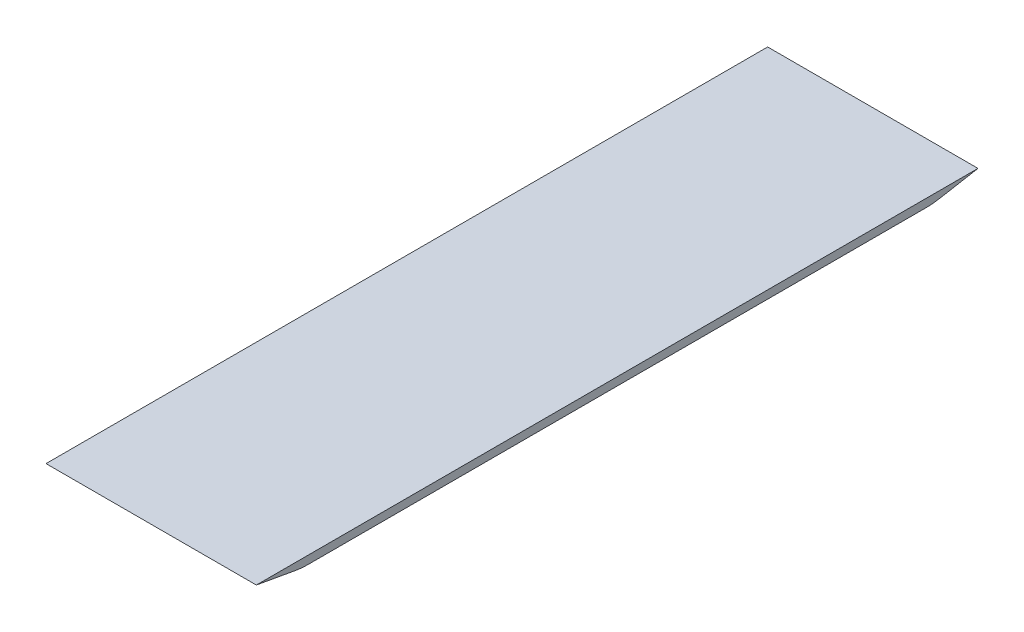
ISO-10303-21;
HEADER;
FILE_DESCRIPTION(('STEP AP214'),'2;1');
FILE_NAME('part.step','',(''),(''),'','','');
FILE_SCHEMA(('AUTOMOTIVE_DESIGN { 1 0 10303 214 1 1 1 1 }'));
ENDSEC;
DATA;
#1=APPLICATION_CONTEXT('core data for automotive mechanical design processes');
#2=APPLICATION_PROTOCOL_DEFINITION('international standard','automotive_design',2000,#1);
#3=PRODUCT_CONTEXT('',#1,'mechanical');
#4=PRODUCT('Part','Part','',(#3));
#5=PRODUCT_RELATED_PRODUCT_CATEGORY('part','',(#4));
#6=PRODUCT_DEFINITION_FORMATION('','',#4);
#7=PRODUCT_DEFINITION_CONTEXT('part definition',#1,'design');
#8=PRODUCT_DEFINITION('design','',#6,#7);
#9=PRODUCT_DEFINITION_SHAPE('','',#8);
#10=(LENGTH_UNIT() NAMED_UNIT(*) SI_UNIT(.MILLI.,.METRE.));
#11=(NAMED_UNIT(*) PLANE_ANGLE_UNIT() SI_UNIT($,.RADIAN.));
#12=(NAMED_UNIT(*) SI_UNIT($,.STERADIAN.) SOLID_ANGLE_UNIT());
#13=UNCERTAINTY_MEASURE_WITH_UNIT(LENGTH_MEASURE(1.E-05),#10,'distance_accuracy_value','');
#14=(GEOMETRIC_REPRESENTATION_CONTEXT(3) GLOBAL_UNCERTAINTY_ASSIGNED_CONTEXT((#13)) GLOBAL_UNIT_ASSIGNED_CONTEXT((#10,
#11,#12)) REPRESENTATION_CONTEXT('',''));
#15=CARTESIAN_POINT('',(0.,0.,0.));
#16=DIRECTION('',(0.,0.,1.));
#17=DIRECTION('',(1.,0.,0.));
#18=AXIS2_PLACEMENT_3D('',#15,#16,#17);
#19=CARTESIAN_POINT('',(130.,0.,-446.));
#20=DIRECTION('',(0.,-0.984427575508482,-0.175790638483657));
#21=DIRECTION('',(0.,0.175790638483657,-0.984427575508482));
#22=AXIS2_PLACEMENT_3D('',#19,#20,#21);
#23=PLANE('',#22);
#24=DIRECTION('',(0.,-0.175790638483657,0.984427575508482));
#25=VECTOR('',#24,1.);
#26=CARTESIAN_POINT('',(130.,0.,-446.));
#27=LINE('',#26,#25);
#28=CARTESIAN_POINT('',(130.,0.,-446.));
#29=VERTEX_POINT('',#28);
#30=CARTESIAN_POINT('',(130.,-4.22137877542409,-422.360278857625));
#31=VERTEX_POINT('',#30);
#32=EDGE_CURVE('E111',#29,#31,#27,.T.);
#33=ORIENTED_EDGE('',*,*,#32,.T.);
#34=DIRECTION('',(-1.,0.,0.));
#35=VECTOR('',#34,1.);
#36=CARTESIAN_POINT('',(130.,-4.22137877542409,-422.360278857625));
#37=LINE('',#36,#35);
#38=CARTESIAN_POINT('',(0.,-4.22137877542409,-422.360278857625));
#39=VERTEX_POINT('',#38);
#40=EDGE_CURVE('E11',#31,#39,#37,.T.);
#41=ORIENTED_EDGE('',*,*,#40,.T.);
#42=DIRECTION('',(0.,-0.175790638483657,0.984427575508482));
#43=VECTOR('',#42,1.);
#44=CARTESIAN_POINT('',(0.,0.,-446.));
#45=LINE('',#44,#43);
#46=CARTESIAN_POINT('',(0.,0.,-446.));
#47=VERTEX_POINT('',#46);
#48=EDGE_CURVE('E115',#47,#39,#45,.T.);
#49=ORIENTED_EDGE('',*,*,#48,.F.);
#50=DIRECTION('',(-1.,0.,0.));
#51=VECTOR('',#50,1.);
#52=CARTESIAN_POINT('',(130.,0.,-446.));
#53=LINE('',#52,#51);
#54=EDGE_CURVE('E108',#29,#47,#53,.T.);
#55=ORIENTED_EDGE('',*,*,#54,.F.);
#56=EDGE_LOOP('',(#33,#41,#49,#55));
#57=FACE_BOUND('',#56,.T.);
#58=ADVANCED_FACE('F39',(#57),#23,.T.);
#59=CARTESIAN_POINT('',(130.,0.,0.));
#60=DIRECTION('',(0.,1.,0.));
#61=DIRECTION('',(0.,0.,1.));
#62=AXIS2_PLACEMENT_3D('',#59,#60,#61);
#63=PLANE('',#62);
#64=DIRECTION('',(0.,0.,-1.));
#65=VECTOR('',#64,1.);
#66=CARTESIAN_POINT('',(0.,0.,0.));
#67=LINE('',#66,#65);
#68=CARTESIAN_POINT('',(0.,0.,0.));
#69=VERTEX_POINT('',#68);
#70=EDGE_CURVE('E107',#69,#47,#67,.T.);
#71=ORIENTED_EDGE('',*,*,#70,.F.);
#72=DIRECTION('',(-1.,0.,0.));
#73=VECTOR('',#72,1.);
#74=CARTESIAN_POINT('',(130.,0.,0.));
#75=LINE('',#74,#73);
#76=CARTESIAN_POINT('',(130.,0.,0.));
#77=VERTEX_POINT('',#76);
#78=EDGE_CURVE('E96',#77,#69,#75,.T.);
#79=ORIENTED_EDGE('',*,*,#78,.F.);
#80=DIRECTION('',(0.,0.,-1.));
#81=VECTOR('',#80,1.);
#82=CARTESIAN_POINT('',(130.,0.,0.));
#83=LINE('',#82,#81);
#84=EDGE_CURVE('E100',#77,#29,#83,.T.);
#85=ORIENTED_EDGE('',*,*,#84,.T.);
#86=ORIENTED_EDGE('',*,*,#54,.T.);
#87=EDGE_LOOP('',(#71,#79,#85,#86));
#88=FACE_BOUND('',#87,.T.);
#89=ADVANCED_FACE('F105',(#88),#63,.T.);
#90=CARTESIAN_POINT('',(130.,-5.00000000000005,-28.));
#91=DIRECTION('',(0.,-0.984427575508482,0.175790638483659));
#92=DIRECTION('',(0.,-0.175790638483659,-0.984427575508482));
#93=AXIS2_PLACEMENT_3D('',#90,#91,#92);
#94=PLANE('',#93);
#95=DIRECTION('',(0.,0.175790638483659,0.984427575508482));
#96=VECTOR('',#95,1.);
#97=CARTESIAN_POINT('',(0.,-5.00000000000005,-28.));
#98=LINE('',#97,#96);
#99=CARTESIAN_POINT('',(0.,-4.22137877542412,-23.6397211423749));
#100=VERTEX_POINT('',#99);
#101=EDGE_CURVE('E121',#100,#69,#98,.T.);
#102=ORIENTED_EDGE('',*,*,#101,.F.);
#103=DIRECTION('',(-1.,0.,0.));
#104=VECTOR('',#103,1.);
#105=CARTESIAN_POINT('',(130.,-4.22137877542412,-23.6397211423749));
#106=LINE('',#105,#104);
#107=CARTESIAN_POINT('',(130.,-4.22137877542412,-23.6397211423749));
#108=VERTEX_POINT('',#107);
#109=EDGE_CURVE('E62',#100,#108,#106,.F.);
#110=ORIENTED_EDGE('',*,*,#109,.T.);
#111=DIRECTION('',(0.,0.175790638483659,0.984427575508482));
#112=VECTOR('',#111,1.);
#113=CARTESIAN_POINT('',(130.,-5.00000000000005,-28.));
#114=LINE('',#113,#112);
#115=EDGE_CURVE('E93',#108,#77,#114,.T.);
#116=ORIENTED_EDGE('',*,*,#115,.T.);
#117=ORIENTED_EDGE('',*,*,#78,.T.);
#118=EDGE_LOOP('',(#102,#110,#116,#117));
#119=FACE_BOUND('',#118,.T.);
#120=ADVANCED_FACE('F95',(#119),#94,.T.);
#121=CARTESIAN_POINT('',(130.,-5.,-418.));
#122=DIRECTION('',(0.,-1.,0.));
#123=DIRECTION('',(0.,0.,-1.));
#124=AXIS2_PLACEMENT_3D('',#121,#122,#123);
#125=PLANE('',#124);
#126=DIRECTION('',(0.,0.,1.));
#127=VECTOR('',#126,1.);
#128=CARTESIAN_POINT('',(130.,-5.,-418.));
#129=LINE('',#128,#127);
#130=CARTESIAN_POINT('',(130.,-5.,-413.570746933442));
#131=VERTEX_POINT('',#130);
#132=CARTESIAN_POINT('',(130.,-5.00000000000005,-32.4292530665578));
#133=VERTEX_POINT('',#132);
#134=EDGE_CURVE('E101',#131,#133,#129,.T.);
#135=ORIENTED_EDGE('',*,*,#134,.T.);
#136=DIRECTION('',(-1.,0.,0.));
#137=VECTOR('',#136,1.);
#138=CARTESIAN_POINT('',(130.,-5.00000000000005,-32.4292530665578));
#139=LINE('',#138,#137);
#140=CARTESIAN_POINT('',(0.,-5.00000000000005,-32.4292530665578));
#141=VERTEX_POINT('',#140);
#142=EDGE_CURVE('E127',#133,#141,#139,.T.);
#143=ORIENTED_EDGE('',*,*,#142,.T.);
#144=DIRECTION('',(0.,0.,1.));
#145=VECTOR('',#144,1.);
#146=CARTESIAN_POINT('',(0.,-5.,-418.));
#147=LINE('',#146,#145);
#148=CARTESIAN_POINT('',(0.,-5.,-413.570746933442));
#149=VERTEX_POINT('',#148);
#150=EDGE_CURVE('E118',#149,#141,#147,.T.);
#151=ORIENTED_EDGE('',*,*,#150,.F.);
#152=DIRECTION('',(-1.,0.,0.));
#153=VECTOR('',#152,1.);
#154=CARTESIAN_POINT('',(130.,-5.,-413.570746933442));
#155=LINE('',#154,#153);
#156=EDGE_CURVE('E124',#149,#131,#155,.F.);
#157=ORIENTED_EDGE('',*,*,#156,.T.);
#158=EDGE_LOOP('',(#135,#143,#151,#157));
#159=FACE_BOUND('',#158,.T.);
#160=ADVANCED_FACE('F139',(#159),#125,.T.);
#161=CARTESIAN_POINT('',(130.,0.,0.));
#162=DIRECTION('',(-1.,0.,0.));
#163=DIRECTION('',(0.,0.,1.));
#164=AXIS2_PLACEMENT_3D('',#161,#162,#163);
#165=PLANE('',#164);
#166=ORIENTED_EDGE('',*,*,#115,.F.);
#167=CARTESIAN_POINT('',(130.,45.,-32.4292530665578));
#168=DIRECTION('',(-1.,0.,0.));
#169=DIRECTION('',(0.,0.,1.));
#170=AXIS2_PLACEMENT_3D('',#167,#168,#169);
#171=CIRCLE('',#170,50.);
#172=EDGE_CURVE('E47',#108,#133,#171,.F.);
#173=ORIENTED_EDGE('',*,*,#172,.T.);
#174=ORIENTED_EDGE('',*,*,#134,.F.);
#175=CARTESIAN_POINT('',(130.,45.,-413.570746933442));
#176=DIRECTION('',(-1.,0.,0.));
#177=DIRECTION('',(0.,0.,1.));
#178=AXIS2_PLACEMENT_3D('',#175,#176,#177);
#179=CIRCLE('',#178,50.);
#180=EDGE_CURVE('E54',#131,#31,#179,.F.);
#181=ORIENTED_EDGE('',*,*,#180,.T.);
#182=ORIENTED_EDGE('',*,*,#32,.F.);
#183=ORIENTED_EDGE('',*,*,#84,.F.);
#184=EDGE_LOOP('',(#166,#173,#174,#181,#182,#183));
#185=FACE_BOUND('',#184,.T.);
#186=ADVANCED_FACE('F110',(#185),#165,.F.);
#187=CARTESIAN_POINT('',(0.,0.,0.));
#188=DIRECTION('',(-1.,0.,0.));
#189=DIRECTION('',(0.,0.,1.));
#190=AXIS2_PLACEMENT_3D('',#187,#188,#189);
#191=PLANE('',#190);
#192=ORIENTED_EDGE('',*,*,#150,.T.);
#193=CARTESIAN_POINT('',(0.,45.,-32.4292530665578));
#194=DIRECTION('',(-1.,0.,0.));
#195=DIRECTION('',(0.,0.,1.));
#196=AXIS2_PLACEMENT_3D('',#193,#194,#195);
#197=CIRCLE('',#196,50.);
#198=EDGE_CURVE('E132',#141,#100,#197,.T.);
#199=ORIENTED_EDGE('',*,*,#198,.T.);
#200=ORIENTED_EDGE('',*,*,#101,.T.);
#201=ORIENTED_EDGE('',*,*,#70,.T.);
#202=ORIENTED_EDGE('',*,*,#48,.T.);
#203=CARTESIAN_POINT('',(0.,45.,-413.570746933442));
#204=DIRECTION('',(-1.,0.,0.));
#205=DIRECTION('',(0.,0.,1.));
#206=AXIS2_PLACEMENT_3D('',#203,#204,#205);
#207=CIRCLE('',#206,50.);
#208=EDGE_CURVE('E130',#39,#149,#207,.T.);
#209=ORIENTED_EDGE('',*,*,#208,.T.);
#210=EDGE_LOOP('',(#192,#199,#200,#201,#202,#209));
#211=FACE_BOUND('',#210,.T.);
#212=ADVANCED_FACE('F144',(#211),#191,.T.);
#213=CARTESIAN_POINT('',(130.,45.,-32.4292530665578));
#214=DIRECTION('',(-1.,0.,0.));
#215=DIRECTION('',(0.,0.,1.));
#216=AXIS2_PLACEMENT_3D('',#213,#214,#215);
#217=CYLINDRICAL_SURFACE('',#216,50.);
#218=ORIENTED_EDGE('',*,*,#172,.F.);
#219=ORIENTED_EDGE('',*,*,#109,.F.);
#220=ORIENTED_EDGE('',*,*,#198,.F.);
#221=ORIENTED_EDGE('',*,*,#142,.F.);
#222=EDGE_LOOP('',(#218,#219,#220,#221));
#223=FACE_BOUND('',#222,.T.);
#224=ADVANCED_FACE('F142',(#223),#217,.T.);
#225=CARTESIAN_POINT('',(130.,45.,-413.570746933442));
#226=DIRECTION('',(-1.,0.,0.));
#227=DIRECTION('',(0.,0.,1.));
#228=AXIS2_PLACEMENT_3D('',#225,#226,#227);
#229=CYLINDRICAL_SURFACE('',#228,50.);
#230=ORIENTED_EDGE('',*,*,#180,.F.);
#231=ORIENTED_EDGE('',*,*,#156,.F.);
#232=ORIENTED_EDGE('',*,*,#208,.F.);
#233=ORIENTED_EDGE('',*,*,#40,.F.);
#234=EDGE_LOOP('',(#230,#231,#232,#233));
#235=FACE_BOUND('',#234,.T.);
#236=ADVANCED_FACE('F41',(#235),#229,.T.);
#237=CLOSED_SHELL('',(#58,#89,#120,#160,#186,#212,#224,#236));
#238=MANIFOLD_SOLID_BREP('B2',#237);
#239=ADVANCED_BREP_SHAPE_REPRESENTATION('',(#18,#238),#14);
#240=SHAPE_DEFINITION_REPRESENTATION(#9,#239);
ENDSEC;
END-ISO-10303-21;
